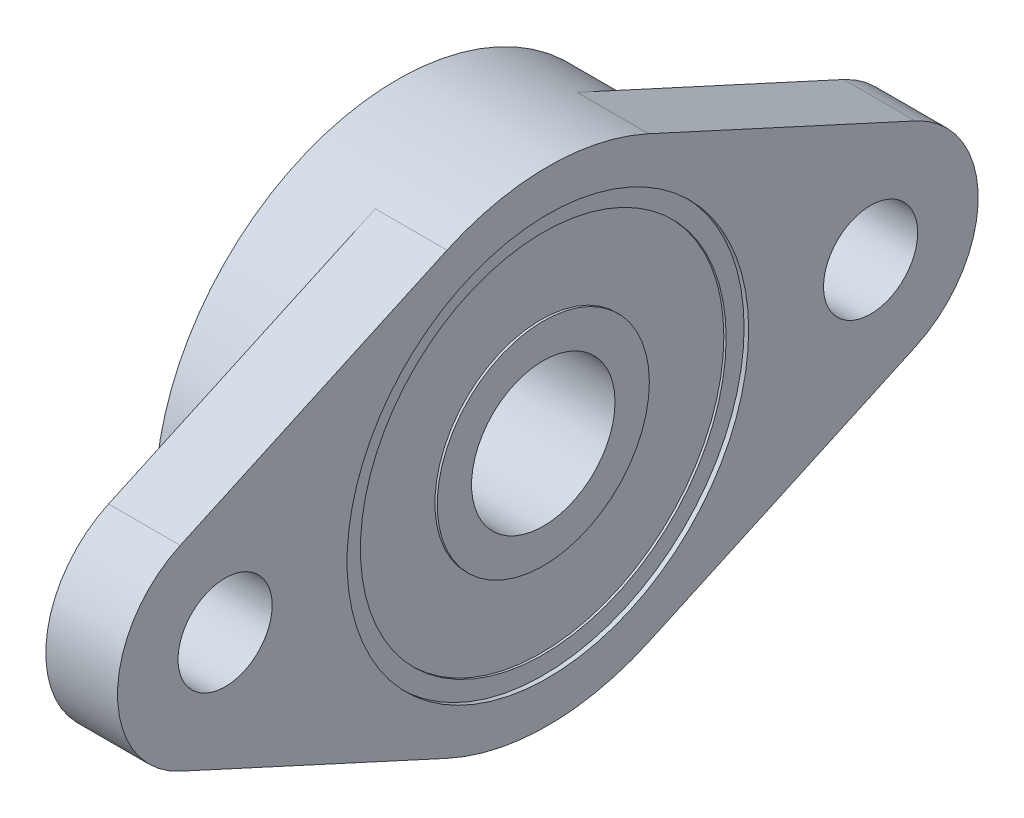
ISO-10303-21;
HEADER;
FILE_DESCRIPTION(('STEP AP214'),'2;1');
FILE_NAME('part.step','',(''),(''),'','','');
FILE_SCHEMA(('AUTOMOTIVE_DESIGN { 1 0 10303 214 1 1 1 1 }'));
ENDSEC;
DATA;
#1=APPLICATION_CONTEXT('core data for automotive mechanical design processes');
#2=APPLICATION_PROTOCOL_DEFINITION('international standard','automotive_design',2000,#1);
#3=PRODUCT_CONTEXT('',#1,'mechanical');
#4=PRODUCT('Part','Part','',(#3));
#5=PRODUCT_RELATED_PRODUCT_CATEGORY('part','',(#4));
#6=PRODUCT_DEFINITION_FORMATION('','',#4);
#7=PRODUCT_DEFINITION_CONTEXT('part definition',#1,'design');
#8=PRODUCT_DEFINITION('design','',#6,#7);
#9=PRODUCT_DEFINITION_SHAPE('','',#8);
#10=(LENGTH_UNIT() NAMED_UNIT(*) SI_UNIT(.MILLI.,.METRE.));
#11=(NAMED_UNIT(*) PLANE_ANGLE_UNIT() SI_UNIT($,.RADIAN.));
#12=(NAMED_UNIT(*) SI_UNIT($,.STERADIAN.) SOLID_ANGLE_UNIT());
#13=UNCERTAINTY_MEASURE_WITH_UNIT(LENGTH_MEASURE(1.E-05),#10,'distance_accuracy_value','');
#14=(GEOMETRIC_REPRESENTATION_CONTEXT(3) GLOBAL_UNCERTAINTY_ASSIGNED_CONTEXT((#13)) GLOBAL_UNIT_ASSIGNED_CONTEXT((#10,
#11,#12)) REPRESENTATION_CONTEXT('',''));
#15=CARTESIAN_POINT('',(0.,0.,0.));
#16=DIRECTION('',(0.,0.,1.));
#17=DIRECTION('',(1.,0.,0.));
#18=AXIS2_PLACEMENT_3D('',#15,#16,#17);
#19=CARTESIAN_POINT('',(-0.255431619265122,0.,-4.));
#20=DIRECTION('',(1.,0.,0.));
#21=DIRECTION('',(0.,0.,-1.));
#22=AXIS2_PLACEMENT_3D('',#19,#20,#21);
#23=PLANE('',#22);
#24=CARTESIAN_POINT('',(-0.255431619265122,0.,0.));
#25=DIRECTION('',(1.,0.,0.));
#26=DIRECTION('',(0.,0.,-1.));
#27=AXIS2_PLACEMENT_3D('',#24,#25,#26);
#28=CIRCLE('',#27,5.915);
#29=CARTESIAN_POINT('',(-0.255431619265122,0.,-5.915));
#30=VERTEX_POINT('',#29);
#31=EDGE_CURVE('E229',#30,#30,#28,.T.);
#32=ORIENTED_EDGE('',*,*,#31,.T.);
#33=EDGE_LOOP('',(#32));
#34=FACE_BOUND('',#33,.T.);
#35=CARTESIAN_POINT('',(-0.255431619265122,0.,0.));
#36=DIRECTION('',(1.,0.,0.));
#37=DIRECTION('',(0.,0.,-1.));
#38=AXIS2_PLACEMENT_3D('',#35,#36,#37);
#39=CIRCLE('',#38,4.);
#40=CARTESIAN_POINT('',(-0.255431619265122,0.,-4.));
#41=VERTEX_POINT('',#40);
#42=EDGE_CURVE('E169',#41,#41,#39,.T.);
#43=ORIENTED_EDGE('',*,*,#42,.F.);
#44=EDGE_LOOP('',(#43));
#45=FACE_BOUND('',#44,.T.);
#46=ADVANCED_FACE('F45',(#34,#45),#23,.T.);
#47=CARTESIAN_POINT('',(0.,0.,0.));
#48=DIRECTION('',(1.,0.,0.));
#49=DIRECTION('',(0.,0.,-1.));
#50=AXIS2_PLACEMENT_3D('',#47,#48,#49);
#51=CYLINDRICAL_SURFACE('',#50,5.915);
#52=CARTESIAN_POINT('',(-0.384561476860014,0.,0.));
#53=DIRECTION('',(1.,0.,0.));
#54=DIRECTION('',(0.,0.,-1.));
#55=AXIS2_PLACEMENT_3D('',#52,#53,#54);
#56=CIRCLE('',#55,5.915);
#57=CARTESIAN_POINT('',(-0.384561476860014,0.,-5.915));
#58=VERTEX_POINT('',#57);
#59=EDGE_CURVE('E227',#58,#58,#56,.T.);
#60=ORIENTED_EDGE('',*,*,#59,.T.);
#61=EDGE_LOOP('',(#60));
#62=FACE_BOUND('',#61,.T.);
#63=ORIENTED_EDGE('',*,*,#31,.F.);
#64=EDGE_LOOP('',(#63));
#65=FACE_BOUND('',#64,.T.);
#66=ADVANCED_FACE('F266',(#62,#65),#51,.T.);
#67=CARTESIAN_POINT('',(-0.384561476860014,0.,-5.915));
#68=DIRECTION('',(1.,0.,0.));
#69=DIRECTION('',(0.,0.,-1.));
#70=AXIS2_PLACEMENT_3D('',#67,#68,#69);
#71=PLANE('',#70);
#72=CARTESIAN_POINT('',(-0.384561476860014,0.,0.));
#73=DIRECTION('',(1.,0.,0.));
#74=DIRECTION('',(0.,0.,-1.));
#75=AXIS2_PLACEMENT_3D('',#72,#73,#74);
#76=CIRCLE('',#75,10.2);
#77=CARTESIAN_POINT('',(-0.384561476860014,0.,-10.2));
#78=VERTEX_POINT('',#77);
#79=EDGE_CURVE('E224',#78,#78,#76,.T.);
#80=ORIENTED_EDGE('',*,*,#79,.T.);
#81=EDGE_LOOP('',(#80));
#82=FACE_BOUND('',#81,.T.);
#83=ORIENTED_EDGE('',*,*,#59,.F.);
#84=EDGE_LOOP('',(#83));
#85=FACE_BOUND('',#84,.T.);
#86=ADVANCED_FACE('F271',(#82,#85),#71,.T.);
#87=CARTESIAN_POINT('',(0.,0.,0.));
#88=DIRECTION('',(1.,0.,0.));
#89=DIRECTION('',(0.,0.,-1.));
#90=AXIS2_PLACEMENT_3D('',#87,#88,#89);
#91=CYLINDRICAL_SURFACE('',#90,10.2);
#92=CARTESIAN_POINT('',(-0.255431619265122,0.,0.));
#93=DIRECTION('',(1.,0.,0.));
#94=DIRECTION('',(0.,0.,-1.));
#95=AXIS2_PLACEMENT_3D('',#92,#93,#94);
#96=CIRCLE('',#95,10.2);
#97=CARTESIAN_POINT('',(-0.255431619265122,0.,-10.2));
#98=VERTEX_POINT('',#97);
#99=EDGE_CURVE('E221',#98,#98,#96,.T.);
#100=ORIENTED_EDGE('',*,*,#99,.T.);
#101=EDGE_LOOP('',(#100));
#102=FACE_BOUND('',#101,.T.);
#103=ORIENTED_EDGE('',*,*,#79,.F.);
#104=EDGE_LOOP('',(#103));
#105=FACE_BOUND('',#104,.T.);
#106=ADVANCED_FACE('F345',(#102,#105),#91,.F.);
#107=CARTESIAN_POINT('',(-0.255431619265122,0.,-10.2));
#108=DIRECTION('',(1.,0.,0.));
#109=DIRECTION('',(0.,0.,-1.));
#110=AXIS2_PLACEMENT_3D('',#107,#108,#109);
#111=PLANE('',#110);
#112=CARTESIAN_POINT('',(-0.255431619265122,0.,0.));
#113=DIRECTION('',(1.,0.,0.));
#114=DIRECTION('',(0.,0.,-1.));
#115=AXIS2_PLACEMENT_3D('',#112,#113,#114);
#116=CIRCLE('',#115,11.2);
#117=CARTESIAN_POINT('',(-0.255431619265122,0.,-11.2));
#118=VERTEX_POINT('',#117);
#119=EDGE_CURVE('E218',#118,#118,#116,.T.);
#120=ORIENTED_EDGE('',*,*,#119,.T.);
#121=EDGE_LOOP('',(#120));
#122=FACE_BOUND('',#121,.T.);
#123=ORIENTED_EDGE('',*,*,#99,.F.);
#124=EDGE_LOOP('',(#123));
#125=FACE_BOUND('',#124,.T.);
#126=ADVANCED_FACE('F341',(#122,#125),#111,.T.);
#127=CARTESIAN_POINT('',(0.,0.,0.));
#128=DIRECTION('',(1.,0.,0.));
#129=DIRECTION('',(0.,0.,-1.));
#130=AXIS2_PLACEMENT_3D('',#127,#128,#129);
#131=CYLINDRICAL_SURFACE('',#130,11.2);
#132=CARTESIAN_POINT('',(0.,0.,0.));
#133=DIRECTION('',(1.,0.,0.));
#134=DIRECTION('',(0.,0.,-1.));
#135=AXIS2_PLACEMENT_3D('',#132,#133,#134);
#136=CIRCLE('',#135,11.2);
#137=CARTESIAN_POINT('',(0.,0.,-11.2));
#138=VERTEX_POINT('',#137);
#139=EDGE_CURVE('E215',#138,#138,#136,.T.);
#140=ORIENTED_EDGE('',*,*,#139,.T.);
#141=EDGE_LOOP('',(#140));
#142=FACE_BOUND('',#141,.T.);
#143=ORIENTED_EDGE('',*,*,#119,.F.);
#144=EDGE_LOOP('',(#143));
#145=FACE_BOUND('',#144,.T.);
#146=ADVANCED_FACE('F336',(#142,#145),#131,.F.);
#147=CARTESIAN_POINT('',(0.,0.,-11.2));
#148=DIRECTION('',(1.,0.,0.));
#149=DIRECTION('',(0.,0.,-1.));
#150=AXIS2_PLACEMENT_3D('',#147,#148,#149);
#151=PLANE('',#150);
#152=CARTESIAN_POINT('',(0.,0.,0.));
#153=DIRECTION('',(1.,0.,0.));
#154=DIRECTION('',(0.,0.,-1.));
#155=AXIS2_PLACEMENT_3D('',#152,#153,#154);
#156=CIRCLE('',#155,13.5);
#157=CARTESIAN_POINT('',(0.,12.2723011289652,-5.625));
#158=VERTEX_POINT('',#157);
#159=CARTESIAN_POINT('',(0.,12.2723011289652,5.625));
#160=VERTEX_POINT('',#159);
#161=EDGE_CURVE('E213',#158,#160,#156,.T.);
#162=ORIENTED_EDGE('',*,*,#161,.T.);
#163=DIRECTION('',(0.,-0.416666666666666,0.90905934288631));
#164=VECTOR('',#163,1.);
#165=CARTESIAN_POINT('',(0.,12.2723011289652,5.62499999999999));
#166=LINE('',#165,#164);
#167=CARTESIAN_POINT('',(0.,5.45435605731786,20.5));
#168=VERTEX_POINT('',#167);
#169=EDGE_CURVE('E156',#160,#168,#166,.T.);
#170=ORIENTED_EDGE('',*,*,#169,.T.);
#171=CARTESIAN_POINT('',(0.,0.,18.));
#172=DIRECTION('',(1.,0.,0.));
#173=DIRECTION('',(0.,0.,-1.));
#174=AXIS2_PLACEMENT_3D('',#171,#172,#173);
#175=CIRCLE('',#174,6.);
#176=CARTESIAN_POINT('',(0.,-5.45435605731786,20.5));
#177=VERTEX_POINT('',#176);
#178=EDGE_CURVE('E159',#168,#177,#175,.T.);
#179=ORIENTED_EDGE('',*,*,#178,.T.);
#180=DIRECTION('',(0.,-0.416666666666666,-0.90905934288631));
#181=VECTOR('',#180,1.);
#182=CARTESIAN_POINT('',(0.,-12.2723011289652,5.62499999999999));
#183=LINE('',#182,#181);
#184=CARTESIAN_POINT('',(0.,-12.2723011289652,5.62499999999999));
#185=VERTEX_POINT('',#184);
#186=EDGE_CURVE('E59',#177,#185,#183,.T.);
#187=ORIENTED_EDGE('',*,*,#186,.T.);
#188=CARTESIAN_POINT('',(0.,-12.2723011289652,-5.625));
#189=VERTEX_POINT('',#188);
#190=EDGE_CURVE('E212',#185,#189,#156,.T.);
#191=ORIENTED_EDGE('',*,*,#190,.T.);
#192=DIRECTION('',(0.,0.416666666666666,-0.90905934288631));
#193=VECTOR('',#192,1.);
#194=CARTESIAN_POINT('',(0.,-12.2723011289652,-5.62499999999997));
#195=LINE('',#194,#193);
#196=CARTESIAN_POINT('',(0.,-5.45435605731785,-20.5));
#197=VERTEX_POINT('',#196);
#198=EDGE_CURVE('E162',#189,#197,#195,.T.);
#199=ORIENTED_EDGE('',*,*,#198,.T.);
#200=CARTESIAN_POINT('',(0.,0.,-18.));
#201=DIRECTION('',(1.,0.,0.));
#202=DIRECTION('',(0.,0.,-1.));
#203=AXIS2_PLACEMENT_3D('',#200,#201,#202);
#204=CIRCLE('',#203,6.);
#205=CARTESIAN_POINT('',(0.,5.45435605731786,-20.5));
#206=VERTEX_POINT('',#205);
#207=EDGE_CURVE('E153',#206,#197,#204,.F.);
#208=ORIENTED_EDGE('',*,*,#207,.F.);
#209=DIRECTION('',(0.,0.416666666666666,0.90905934288631));
#210=VECTOR('',#209,1.);
#211=CARTESIAN_POINT('',(0.,12.2723011289652,-5.625));
#212=LINE('',#211,#210);
#213=EDGE_CURVE('E66',#206,#158,#212,.T.);
#214=ORIENTED_EDGE('',*,*,#213,.T.);
#215=EDGE_LOOP('',(#162,#170,#179,#187,#191,#199,#208,#214));
#216=FACE_BOUND('',#215,.T.);
#217=ORIENTED_EDGE('',*,*,#139,.F.);
#218=EDGE_LOOP('',(#217));
#219=FACE_BOUND('',#218,.T.);
#220=CARTESIAN_POINT('',(0.,0.,-18.));
#221=DIRECTION('',(1.,0.,0.));
#222=DIRECTION('',(0.,0.,-1.));
#223=AXIS2_PLACEMENT_3D('',#220,#221,#222);
#224=CIRCLE('',#223,2.625);
#225=CARTESIAN_POINT('',(0.,0.,-20.625));
#226=VERTEX_POINT('',#225);
#227=EDGE_CURVE('E165',#226,#226,#224,.F.);
#228=ORIENTED_EDGE('',*,*,#227,.T.);
#229=EDGE_LOOP('',(#228));
#230=FACE_BOUND('',#229,.T.);
#231=CARTESIAN_POINT('',(0.,0.,18.));
#232=DIRECTION('',(1.,0.,0.));
#233=DIRECTION('',(0.,0.,-1.));
#234=AXIS2_PLACEMENT_3D('',#231,#232,#233);
#235=CIRCLE('',#234,2.625);
#236=CARTESIAN_POINT('',(0.,0.,15.375));
#237=VERTEX_POINT('',#236);
#238=EDGE_CURVE('E150',#237,#237,#235,.T.);
#239=ORIENTED_EDGE('',*,*,#238,.F.);
#240=EDGE_LOOP('',(#239));
#241=FACE_BOUND('',#240,.T.);
#242=ADVANCED_FACE('F238',(#216,#219,#230,#241),#151,.T.);
#243=CARTESIAN_POINT('',(0.,0.,0.));
#244=DIRECTION('',(1.,0.,0.));
#245=DIRECTION('',(0.,0.,-1.));
#246=AXIS2_PLACEMENT_3D('',#243,#244,#245);
#247=CYLINDRICAL_SURFACE('',#246,13.5);
#248=DIRECTION('',(1.,0.,0.));
#249=VECTOR('',#248,1.);
#250=CARTESIAN_POINT('',(-4.,-12.2723011289652,-5.625));
#251=LINE('',#250,#249);
#252=CARTESIAN_POINT('',(-4.,-12.2723011289652,-5.625));
#253=VERTEX_POINT('',#252);
#254=EDGE_CURVE('E170',#253,#189,#251,.T.);
#255=ORIENTED_EDGE('',*,*,#254,.T.);
#256=ORIENTED_EDGE('',*,*,#190,.F.);
#257=DIRECTION('',(1.,0.,0.));
#258=VECTOR('',#257,1.);
#259=CARTESIAN_POINT('',(-4.,-12.2723011289652,5.625));
#260=LINE('',#259,#258);
#261=CARTESIAN_POINT('',(-4.,-12.2723011289652,5.625));
#262=VERTEX_POINT('',#261);
#263=EDGE_CURVE('E173',#262,#185,#260,.T.);
#264=ORIENTED_EDGE('',*,*,#263,.F.);
#265=CARTESIAN_POINT('',(-4.,0.,0.));
#266=DIRECTION('',(1.,0.,0.));
#267=DIRECTION('',(0.,0.,-1.));
#268=AXIS2_PLACEMENT_3D('',#265,#266,#267);
#269=CIRCLE('',#268,13.5);
#270=CARTESIAN_POINT('',(-4.,12.2723011289652,5.625));
#271=VERTEX_POINT('',#270);
#272=EDGE_CURVE('E11',#262,#271,#269,.F.);
#273=ORIENTED_EDGE('',*,*,#272,.T.);
#274=DIRECTION('',(1.,0.,0.));
#275=VECTOR('',#274,1.);
#276=CARTESIAN_POINT('',(-4.,12.2723011289652,5.625));
#277=LINE('',#276,#275);
#278=EDGE_CURVE('E179',#271,#160,#277,.T.);
#279=ORIENTED_EDGE('',*,*,#278,.T.);
#280=ORIENTED_EDGE('',*,*,#161,.F.);
#281=DIRECTION('',(1.,0.,0.));
#282=VECTOR('',#281,1.);
#283=CARTESIAN_POINT('',(-4.,12.2723011289652,-5.625));
#284=LINE('',#283,#282);
#285=CARTESIAN_POINT('',(-4.,12.2723011289652,-5.625));
#286=VERTEX_POINT('',#285);
#287=EDGE_CURVE('E119',#286,#158,#284,.T.);
#288=ORIENTED_EDGE('',*,*,#287,.F.);
#289=EDGE_CURVE('E48',#286,#253,#269,.F.);
#290=ORIENTED_EDGE('',*,*,#289,.T.);
#291=EDGE_LOOP('',(#255,#256,#264,#273,#279,#280,#288,#290));
#292=FACE_BOUND('',#291,.T.);
#293=CARTESIAN_POINT('',(-8.4,0.,0.));
#294=DIRECTION('',(1.,0.,0.));
#295=DIRECTION('',(0.,0.,-1.));
#296=AXIS2_PLACEMENT_3D('',#293,#294,#295);
#297=CIRCLE('',#296,13.5);
#298=CARTESIAN_POINT('',(-8.4,0.,-13.5));
#299=VERTEX_POINT('',#298);
#300=EDGE_CURVE('E209',#299,#299,#297,.T.);
#301=ORIENTED_EDGE('',*,*,#300,.T.);
#302=EDGE_LOOP('',(#301));
#303=FACE_BOUND('',#302,.T.);
#304=ADVANCED_FACE('F234',(#292,#303),#247,.T.);
#305=CARTESIAN_POINT('',(-8.4,0.,-11.4728598000304));
#306=DIRECTION('',(-1.,0.,0.));
#307=DIRECTION('',(0.,0.,1.));
#308=AXIS2_PLACEMENT_3D('',#305,#306,#307);
#309=PLANE('',#308);
#310=CARTESIAN_POINT('',(-8.4,0.,0.));
#311=DIRECTION('',(1.,0.,0.));
#312=DIRECTION('',(0.,0.,-1.));
#313=AXIS2_PLACEMENT_3D('',#310,#311,#312);
#314=CIRCLE('',#313,11.4728598000304);
#315=CARTESIAN_POINT('',(-8.4,0.,-11.4728598000304));
#316=VERTEX_POINT('',#315);
#317=EDGE_CURVE('E206',#316,#316,#314,.T.);
#318=ORIENTED_EDGE('',*,*,#317,.T.);
#319=EDGE_LOOP('',(#318));
#320=FACE_BOUND('',#319,.T.);
#321=ORIENTED_EDGE('',*,*,#300,.F.);
#322=EDGE_LOOP('',(#321));
#323=FACE_BOUND('',#322,.T.);
#324=ADVANCED_FACE('F322',(#320,#323),#309,.T.);
#325=CARTESIAN_POINT('',(-8.4,0.,0.));
#326=DIRECTION('',(-1.,0.,0.));
#327=DIRECTION('',(0.,0.,1.));
#328=AXIS2_PLACEMENT_3D('',#325,#326,#327);
#329=CONICAL_SURFACE('',#328,11.4728598000304,0.785398163397448);
#330=CARTESIAN_POINT('',(-8.12714019996958,0.,0.));
#331=DIRECTION('',(1.,0.,0.));
#332=DIRECTION('',(0.,0.,-1.));
#333=AXIS2_PLACEMENT_3D('',#330,#331,#332);
#334=CIRCLE('',#333,11.2);
#335=CARTESIAN_POINT('',(-8.12714019996958,0.,-11.2));
#336=VERTEX_POINT('',#335);
#337=EDGE_CURVE('E203',#336,#336,#334,.T.);
#338=ORIENTED_EDGE('',*,*,#337,.T.);
#339=EDGE_LOOP('',(#338));
#340=FACE_BOUND('',#339,.T.);
#341=ORIENTED_EDGE('',*,*,#317,.F.);
#342=EDGE_LOOP('',(#341));
#343=FACE_BOUND('',#342,.T.);
#344=ADVANCED_FACE('F316',(#340,#343),#329,.F.);
#345=CARTESIAN_POINT('',(0.,0.,0.));
#346=DIRECTION('',(1.,0.,0.));
#347=DIRECTION('',(0.,0.,-1.));
#348=AXIS2_PLACEMENT_3D('',#345,#346,#347);
#349=CYLINDRICAL_SURFACE('',#348,11.2);
#350=CARTESIAN_POINT('',(-7.91539069237696,0.,0.));
#351=DIRECTION('',(1.,0.,0.));
#352=DIRECTION('',(0.,0.,-1.));
#353=AXIS2_PLACEMENT_3D('',#350,#351,#352);
#354=CIRCLE('',#353,11.2);
#355=CARTESIAN_POINT('',(-7.91539069237696,0.,-11.2));
#356=VERTEX_POINT('',#355);
#357=EDGE_CURVE('E200',#356,#356,#354,.T.);
#358=ORIENTED_EDGE('',*,*,#357,.T.);
#359=EDGE_LOOP('',(#358));
#360=FACE_BOUND('',#359,.T.);
#361=ORIENTED_EDGE('',*,*,#337,.F.);
#362=EDGE_LOOP('',(#361));
#363=FACE_BOUND('',#362,.T.);
#364=ADVANCED_FACE('F310',(#360,#363),#349,.F.);
#365=CARTESIAN_POINT('',(-7.91539069237696,0.,-10.2));
#366=DIRECTION('',(-1.,0.,0.));
#367=DIRECTION('',(0.,0.,1.));
#368=AXIS2_PLACEMENT_3D('',#365,#366,#367);
#369=PLANE('',#368);
#370=CARTESIAN_POINT('',(-7.91539069237696,0.,0.));
#371=DIRECTION('',(1.,0.,0.));
#372=DIRECTION('',(0.,0.,-1.));
#373=AXIS2_PLACEMENT_3D('',#370,#371,#372);
#374=CIRCLE('',#373,10.2);
#375=CARTESIAN_POINT('',(-7.91539069237696,0.,-10.2));
#376=VERTEX_POINT('',#375);
#377=EDGE_CURVE('E197',#376,#376,#374,.T.);
#378=ORIENTED_EDGE('',*,*,#377,.T.);
#379=EDGE_LOOP('',(#378));
#380=FACE_BOUND('',#379,.T.);
#381=ORIENTED_EDGE('',*,*,#357,.F.);
#382=EDGE_LOOP('',(#381));
#383=FACE_BOUND('',#382,.T.);
#384=ADVANCED_FACE('F304',(#380,#383),#369,.T.);
#385=CARTESIAN_POINT('',(0.,0.,0.));
#386=DIRECTION('',(1.,0.,0.));
#387=DIRECTION('',(0.,0.,-1.));
#388=AXIS2_PLACEMENT_3D('',#385,#386,#387);
#389=CYLINDRICAL_SURFACE('',#388,10.2);
#390=CARTESIAN_POINT('',(-7.67835454936994,0.,0.));
#391=DIRECTION('',(1.,0.,0.));
#392=DIRECTION('',(0.,0.,-1.));
#393=AXIS2_PLACEMENT_3D('',#390,#391,#392);
#394=CIRCLE('',#393,10.2);
#395=CARTESIAN_POINT('',(-7.67835454936994,0.,-10.2));
#396=VERTEX_POINT('',#395);
#397=EDGE_CURVE('E194',#396,#396,#394,.T.);
#398=ORIENTED_EDGE('',*,*,#397,.T.);
#399=EDGE_LOOP('',(#398));
#400=FACE_BOUND('',#399,.T.);
#401=ORIENTED_EDGE('',*,*,#377,.F.);
#402=EDGE_LOOP('',(#401));
#403=FACE_BOUND('',#402,.T.);
#404=ADVANCED_FACE('F298',(#400,#403),#389,.F.);
#405=CARTESIAN_POINT('',(-7.67835454936994,0.,-5.915));
#406=DIRECTION('',(-1.,0.,0.));
#407=DIRECTION('',(0.,0.,1.));
#408=AXIS2_PLACEMENT_3D('',#405,#406,#407);
#409=PLANE('',#408);
#410=CARTESIAN_POINT('',(-7.67835454936994,0.,0.));
#411=DIRECTION('',(1.,0.,0.));
#412=DIRECTION('',(0.,0.,-1.));
#413=AXIS2_PLACEMENT_3D('',#410,#411,#412);
#414=CIRCLE('',#413,5.915);
#415=CARTESIAN_POINT('',(-7.67835454936994,0.,-5.915));
#416=VERTEX_POINT('',#415);
#417=EDGE_CURVE('E191',#416,#416,#414,.T.);
#418=ORIENTED_EDGE('',*,*,#417,.T.);
#419=EDGE_LOOP('',(#418));
#420=FACE_BOUND('',#419,.T.);
#421=ORIENTED_EDGE('',*,*,#397,.F.);
#422=EDGE_LOOP('',(#421));
#423=FACE_BOUND('',#422,.T.);
#424=ADVANCED_FACE('F292',(#420,#423),#409,.T.);
#425=CARTESIAN_POINT('',(0.,0.,0.));
#426=DIRECTION('',(1.,0.,0.));
#427=DIRECTION('',(0.,0.,-1.));
#428=AXIS2_PLACEMENT_3D('',#425,#426,#427);
#429=CYLINDRICAL_SURFACE('',#428,5.915);
#430=CARTESIAN_POINT('',(-11.7,0.,0.));
#431=DIRECTION('',(1.,0.,0.));
#432=DIRECTION('',(0.,0.,-1.));
#433=AXIS2_PLACEMENT_3D('',#430,#431,#432);
#434=CIRCLE('',#433,5.915);
#435=CARTESIAN_POINT('',(-11.7,0.,-5.915));
#436=VERTEX_POINT('',#435);
#437=EDGE_CURVE('E188',#436,#436,#434,.T.);
#438=ORIENTED_EDGE('',*,*,#437,.T.);
#439=EDGE_LOOP('',(#438));
#440=FACE_BOUND('',#439,.T.);
#441=ORIENTED_EDGE('',*,*,#417,.F.);
#442=EDGE_LOOP('',(#441));
#443=FACE_BOUND('',#442,.T.);
#444=ADVANCED_FACE('F286',(#440,#443),#429,.T.);
#445=CARTESIAN_POINT('',(-11.7,0.,-4.));
#446=DIRECTION('',(-1.,0.,0.));
#447=DIRECTION('',(0.,0.,1.));
#448=AXIS2_PLACEMENT_3D('',#445,#446,#447);
#449=PLANE('',#448);
#450=CARTESIAN_POINT('',(-11.7,0.,0.));
#451=DIRECTION('',(1.,0.,0.));
#452=DIRECTION('',(0.,0.,-1.));
#453=AXIS2_PLACEMENT_3D('',#450,#451,#452);
#454=CIRCLE('',#453,4.);
#455=CARTESIAN_POINT('',(-11.7,0.,-4.));
#456=VERTEX_POINT('',#455);
#457=EDGE_CURVE('E185',#456,#456,#454,.T.);
#458=ORIENTED_EDGE('',*,*,#457,.T.);
#459=EDGE_LOOP('',(#458));
#460=FACE_BOUND('',#459,.T.);
#461=ORIENTED_EDGE('',*,*,#437,.F.);
#462=EDGE_LOOP('',(#461));
#463=FACE_BOUND('',#462,.T.);
#464=ADVANCED_FACE('F280',(#460,#463),#449,.T.);
#465=CARTESIAN_POINT('',(0.,0.,0.));
#466=DIRECTION('',(1.,0.,0.));
#467=DIRECTION('',(0.,0.,-1.));
#468=AXIS2_PLACEMENT_3D('',#465,#466,#467);
#469=CYLINDRICAL_SURFACE('',#468,4.);
#470=ORIENTED_EDGE('',*,*,#42,.T.);
#471=EDGE_LOOP('',(#470));
#472=FACE_BOUND('',#471,.T.);
#473=ORIENTED_EDGE('',*,*,#457,.F.);
#474=EDGE_LOOP('',(#473));
#475=FACE_BOUND('',#474,.T.);
#476=ADVANCED_FACE('F276',(#472,#475),#469,.F.);
#477=CARTESIAN_POINT('',(-4.,0.,-18.));
#478=DIRECTION('',(1.,0.,0.));
#479=DIRECTION('',(0.,0.,-1.));
#480=AXIS2_PLACEMENT_3D('',#477,#478,#479);
#481=CYLINDRICAL_SURFACE('',#480,2.625);
#482=CARTESIAN_POINT('',(-4.,0.,-18.));
#483=DIRECTION('',(1.,0.,0.));
#484=DIRECTION('',(0.,0.,-1.));
#485=AXIS2_PLACEMENT_3D('',#482,#483,#484);
#486=CIRCLE('',#485,2.625);
#487=CARTESIAN_POINT('',(-4.,0.,-20.625));
#488=VERTEX_POINT('',#487);
#489=EDGE_CURVE('E120',#488,#488,#486,.F.);
#490=ORIENTED_EDGE('',*,*,#489,.T.);
#491=EDGE_LOOP('',(#490));
#492=FACE_BOUND('',#491,.T.);
#493=ORIENTED_EDGE('',*,*,#227,.F.);
#494=EDGE_LOOP('',(#493));
#495=FACE_BOUND('',#494,.T.);
#496=ADVANCED_FACE('F279',(#492,#495),#481,.F.);
#497=CARTESIAN_POINT('',(-4.,0.,-18.));
#498=DIRECTION('',(1.,0.,0.));
#499=DIRECTION('',(0.,0.,-1.));
#500=AXIS2_PLACEMENT_3D('',#497,#498,#499);
#501=CYLINDRICAL_SURFACE('',#500,6.);
#502=ORIENTED_EDGE('',*,*,#207,.T.);
#503=DIRECTION('',(1.,0.,0.));
#504=VECTOR('',#503,1.);
#505=CARTESIAN_POINT('',(-4.,-5.45435605731785,-20.5));
#506=LINE('',#505,#504);
#507=CARTESIAN_POINT('',(-4.,-5.45435605731785,-20.5));
#508=VERTEX_POINT('',#507);
#509=EDGE_CURVE('E125',#508,#197,#506,.T.);
#510=ORIENTED_EDGE('',*,*,#509,.F.);
#511=CARTESIAN_POINT('',(-4.,0.,-18.));
#512=DIRECTION('',(1.,0.,0.));
#513=DIRECTION('',(0.,0.,-1.));
#514=AXIS2_PLACEMENT_3D('',#511,#512,#513);
#515=CIRCLE('',#514,6.);
#516=CARTESIAN_POINT('',(-4.,5.45435605731786,-20.5));
#517=VERTEX_POINT('',#516);
#518=EDGE_CURVE('E123',#517,#508,#515,.F.);
#519=ORIENTED_EDGE('',*,*,#518,.F.);
#520=DIRECTION('',(1.,0.,0.));
#521=VECTOR('',#520,1.);
#522=CARTESIAN_POINT('',(-4.,5.45435605731786,-20.5));
#523=LINE('',#522,#521);
#524=EDGE_CURVE('E111',#517,#206,#523,.T.);
#525=ORIENTED_EDGE('',*,*,#524,.T.);
#526=EDGE_LOOP('',(#502,#510,#519,#525));
#527=FACE_BOUND('',#526,.T.);
#528=ADVANCED_FACE('F124',(#527),#501,.T.);
#529=CARTESIAN_POINT('',(-4.,0.,0.));
#530=DIRECTION('',(1.,0.,0.));
#531=DIRECTION('',(0.,0.,-1.));
#532=AXIS2_PLACEMENT_3D('',#529,#530,#531);
#533=PLANE('',#532);
#534=ORIENTED_EDGE('',*,*,#289,.F.);
#535=DIRECTION('',(0.,0.416666666666666,0.90905934288631));
#536=VECTOR('',#535,1.);
#537=CARTESIAN_POINT('',(-4.,12.2723011289652,-5.625));
#538=LINE('',#537,#536);
#539=EDGE_CURVE('E115',#517,#286,#538,.T.);
#540=ORIENTED_EDGE('',*,*,#539,.F.);
#541=ORIENTED_EDGE('',*,*,#518,.T.);
#542=DIRECTION('',(0.,0.416666666666666,-0.90905934288631));
#543=VECTOR('',#542,1.);
#544=CARTESIAN_POINT('',(-4.,-12.2723011289652,-5.62499999999997));
#545=LINE('',#544,#543);
#546=EDGE_CURVE('E146',#253,#508,#545,.T.);
#547=ORIENTED_EDGE('',*,*,#546,.F.);
#548=EDGE_LOOP('',(#534,#540,#541,#547));
#549=FACE_BOUND('',#548,.T.);
#550=ORIENTED_EDGE('',*,*,#489,.F.);
#551=EDGE_LOOP('',(#550));
#552=FACE_BOUND('',#551,.T.);
#553=ADVANCED_FACE('F131',(#549,#552),#533,.F.);
#554=CARTESIAN_POINT('',(-4.,12.2723011289652,-5.625));
#555=DIRECTION('',(0.,0.90905934288631,-0.416666666666666));
#556=DIRECTION('',(0.,0.416666666666667,0.90905934288631));
#557=AXIS2_PLACEMENT_3D('',#554,#555,#556);
#558=PLANE('',#557);
#559=ORIENTED_EDGE('',*,*,#213,.F.);
#560=ORIENTED_EDGE('',*,*,#524,.F.);
#561=ORIENTED_EDGE('',*,*,#539,.T.);
#562=ORIENTED_EDGE('',*,*,#287,.T.);
#563=EDGE_LOOP('',(#559,#560,#561,#562));
#564=FACE_BOUND('',#563,.T.);
#565=ADVANCED_FACE('F113',(#564),#558,.T.);
#566=CARTESIAN_POINT('',(-4.,-12.2723011289652,-5.62499999999997));
#567=DIRECTION('',(0.,-0.90905934288631,-0.416666666666666));
#568=DIRECTION('',(0.,0.416666666666666,-0.90905934288631));
#569=AXIS2_PLACEMENT_3D('',#566,#567,#568);
#570=PLANE('',#569);
#571=ORIENTED_EDGE('',*,*,#198,.F.);
#572=ORIENTED_EDGE('',*,*,#254,.F.);
#573=ORIENTED_EDGE('',*,*,#546,.T.);
#574=ORIENTED_EDGE('',*,*,#509,.T.);
#575=EDGE_LOOP('',(#571,#572,#573,#574));
#576=FACE_BOUND('',#575,.T.);
#577=ADVANCED_FACE('F252',(#576),#570,.T.);
#578=ORIENTED_EDGE('',*,*,#272,.F.);
#579=DIRECTION('',(0.,-0.416666666666666,-0.90905934288631));
#580=VECTOR('',#579,1.);
#581=CARTESIAN_POINT('',(-4.,-12.2723011289652,5.62499999999999));
#582=LINE('',#581,#580);
#583=CARTESIAN_POINT('',(-4.,-5.45435605731786,20.5));
#584=VERTEX_POINT('',#583);
#585=EDGE_CURVE('E143',#584,#262,#582,.T.);
#586=ORIENTED_EDGE('',*,*,#585,.F.);
#587=CARTESIAN_POINT('',(-4.,0.,18.));
#588=DIRECTION('',(1.,0.,0.));
#589=DIRECTION('',(0.,0.,-1.));
#590=AXIS2_PLACEMENT_3D('',#587,#588,#589);
#591=CIRCLE('',#590,6.);
#592=CARTESIAN_POINT('',(-4.,5.45435605731786,20.5));
#593=VERTEX_POINT('',#592);
#594=EDGE_CURVE('E137',#593,#584,#591,.T.);
#595=ORIENTED_EDGE('',*,*,#594,.F.);
#596=DIRECTION('',(0.,-0.416666666666666,0.90905934288631));
#597=VECTOR('',#596,1.);
#598=CARTESIAN_POINT('',(-4.,12.2723011289652,5.62499999999999));
#599=LINE('',#598,#597);
#600=EDGE_CURVE('E134',#271,#593,#599,.T.);
#601=ORIENTED_EDGE('',*,*,#600,.F.);
#602=EDGE_LOOP('',(#578,#586,#595,#601));
#603=FACE_BOUND('',#602,.T.);
#604=CARTESIAN_POINT('',(-4.,0.,18.));
#605=DIRECTION('',(1.,0.,0.));
#606=DIRECTION('',(0.,0.,-1.));
#607=AXIS2_PLACEMENT_3D('',#604,#605,#606);
#608=CIRCLE('',#607,2.625);
#609=CARTESIAN_POINT('',(-4.,0.,15.375));
#610=VERTEX_POINT('',#609);
#611=EDGE_CURVE('E129',#610,#610,#608,.T.);
#612=ORIENTED_EDGE('',*,*,#611,.T.);
#613=EDGE_LOOP('',(#612));
#614=FACE_BOUND('',#613,.T.);
#615=ADVANCED_FACE('F254',(#603,#614),#533,.F.);
#616=CARTESIAN_POINT('',(-4.,-12.2723011289652,5.62499999999999));
#617=DIRECTION('',(0.,-0.90905934288631,0.416666666666666));
#618=DIRECTION('',(0.,-0.416666666666666,-0.90905934288631));
#619=AXIS2_PLACEMENT_3D('',#616,#617,#618);
#620=PLANE('',#619);
#621=ORIENTED_EDGE('',*,*,#186,.F.);
#622=DIRECTION('',(1.,0.,0.));
#623=VECTOR('',#622,1.);
#624=CARTESIAN_POINT('',(-4.,-5.45435605731786,20.5));
#625=LINE('',#624,#623);
#626=EDGE_CURVE('E175',#584,#177,#625,.T.);
#627=ORIENTED_EDGE('',*,*,#626,.F.);
#628=ORIENTED_EDGE('',*,*,#585,.T.);
#629=ORIENTED_EDGE('',*,*,#263,.T.);
#630=EDGE_LOOP('',(#621,#627,#628,#629));
#631=FACE_BOUND('',#630,.T.);
#632=ADVANCED_FACE('F249',(#631),#620,.T.);
#633=CARTESIAN_POINT('',(-4.,0.,18.));
#634=DIRECTION('',(1.,0.,0.));
#635=DIRECTION('',(0.,0.,-1.));
#636=AXIS2_PLACEMENT_3D('',#633,#634,#635);
#637=CYLINDRICAL_SURFACE('',#636,6.);
#638=ORIENTED_EDGE('',*,*,#178,.F.);
#639=DIRECTION('',(1.,0.,0.));
#640=VECTOR('',#639,1.);
#641=CARTESIAN_POINT('',(-4.,5.45435605731786,20.5));
#642=LINE('',#641,#640);
#643=EDGE_CURVE('E177',#593,#168,#642,.T.);
#644=ORIENTED_EDGE('',*,*,#643,.F.);
#645=ORIENTED_EDGE('',*,*,#594,.T.);
#646=ORIENTED_EDGE('',*,*,#626,.T.);
#647=EDGE_LOOP('',(#638,#644,#645,#646));
#648=FACE_BOUND('',#647,.T.);
#649=ADVANCED_FACE('F246',(#648),#637,.T.);
#650=CARTESIAN_POINT('',(-4.,12.2723011289652,5.62499999999999));
#651=DIRECTION('',(0.,0.90905934288631,0.416666666666666));
#652=DIRECTION('',(0.,-0.416666666666667,0.90905934288631));
#653=AXIS2_PLACEMENT_3D('',#650,#651,#652);
#654=PLANE('',#653);
#655=ORIENTED_EDGE('',*,*,#169,.F.);
#656=ORIENTED_EDGE('',*,*,#278,.F.);
#657=ORIENTED_EDGE('',*,*,#600,.T.);
#658=ORIENTED_EDGE('',*,*,#643,.T.);
#659=EDGE_LOOP('',(#655,#656,#657,#658));
#660=FACE_BOUND('',#659,.T.);
#661=ADVANCED_FACE('F242',(#660),#654,.T.);
#662=CARTESIAN_POINT('',(-4.,0.,18.));
#663=DIRECTION('',(1.,0.,0.));
#664=DIRECTION('',(0.,0.,-1.));
#665=AXIS2_PLACEMENT_3D('',#662,#663,#664);
#666=CYLINDRICAL_SURFACE('',#665,2.625);
#667=ORIENTED_EDGE('',*,*,#611,.F.);
#668=EDGE_LOOP('',(#667));
#669=FACE_BOUND('',#668,.T.);
#670=ORIENTED_EDGE('',*,*,#238,.T.);
#671=EDGE_LOOP('',(#670));
#672=FACE_BOUND('',#671,.T.);
#673=ADVANCED_FACE('F507',(#669,#672),#666,.F.);
#674=CLOSED_SHELL('',(#46,#66,#86,#106,#126,#146,#242,#304,#324,#344,#364,#384,#404,#424,#444,
#464,#476,#496,#528,#553,#565,#577,#615,#632,#649,#661,#673));
#675=MANIFOLD_SOLID_BREP('B2',#674);
#676=ADVANCED_BREP_SHAPE_REPRESENTATION('',(#18,#675),#14);
#677=SHAPE_DEFINITION_REPRESENTATION(#9,#676);
ENDSEC;
END-ISO-10303-21;
